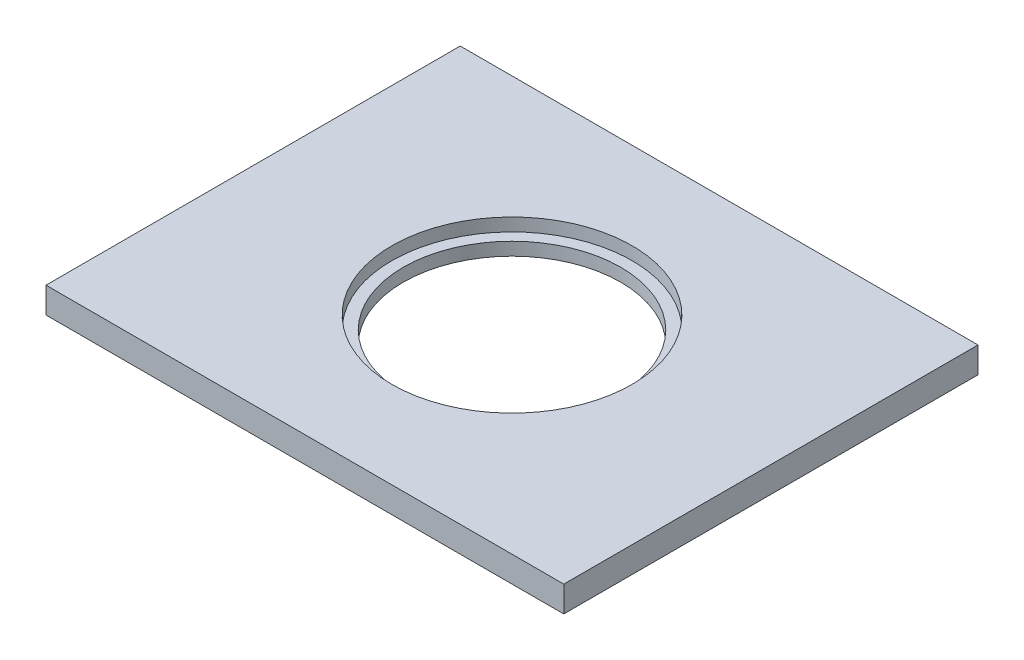
ISO-10303-21;
HEADER;
FILE_DESCRIPTION(('STEP AP214'),'2;1');
FILE_NAME('part.step','',(''),(''),'','','');
FILE_SCHEMA(('AUTOMOTIVE_DESIGN { 1 0 10303 214 1 1 1 1 }'));
ENDSEC;
DATA;
#1=APPLICATION_CONTEXT('core data for automotive mechanical design processes');
#2=APPLICATION_PROTOCOL_DEFINITION('international standard','automotive_design',2000,#1);
#3=PRODUCT_CONTEXT('',#1,'mechanical');
#4=PRODUCT('Part','Part','',(#3));
#5=PRODUCT_RELATED_PRODUCT_CATEGORY('part','',(#4));
#6=PRODUCT_DEFINITION_FORMATION('','',#4);
#7=PRODUCT_DEFINITION_CONTEXT('part definition',#1,'design');
#8=PRODUCT_DEFINITION('design','',#6,#7);
#9=PRODUCT_DEFINITION_SHAPE('','',#8);
#10=(LENGTH_UNIT() NAMED_UNIT(*) SI_UNIT(.MILLI.,.METRE.));
#11=(NAMED_UNIT(*) PLANE_ANGLE_UNIT() SI_UNIT($,.RADIAN.));
#12=(NAMED_UNIT(*) SI_UNIT($,.STERADIAN.) SOLID_ANGLE_UNIT());
#13=UNCERTAINTY_MEASURE_WITH_UNIT(LENGTH_MEASURE(1.E-05),#10,'distance_accuracy_value','');
#14=(GEOMETRIC_REPRESENTATION_CONTEXT(3) GLOBAL_UNCERTAINTY_ASSIGNED_CONTEXT((#13)) GLOBAL_UNIT_ASSIGNED_CONTEXT((#10,
#11,#12)) REPRESENTATION_CONTEXT('',''));
#15=CARTESIAN_POINT('',(0.,0.,0.));
#16=DIRECTION('',(0.,0.,1.));
#17=DIRECTION('',(1.,0.,0.));
#18=AXIS2_PLACEMENT_3D('',#15,#16,#17);
#19=CARTESIAN_POINT('',(0.,-3.,0.));
#20=DIRECTION('',(0.,1.,0.));
#21=DIRECTION('',(0.,0.,1.));
#22=AXIS2_PLACEMENT_3D('',#19,#20,#21);
#23=CYLINDRICAL_SURFACE('',#22,21.);
#24=CARTESIAN_POINT('',(0.,0.,0.));
#25=DIRECTION('',(0.,-1.,0.));
#26=DIRECTION('',(0.,0.,-1.));
#27=AXIS2_PLACEMENT_3D('',#24,#25,#26);
#28=CIRCLE('',#27,21.);
#29=CARTESIAN_POINT('',(0.,0.,-21.));
#30=VERTEX_POINT('',#29);
#31=EDGE_CURVE('E115',#30,#30,#28,.T.);
#32=ORIENTED_EDGE('',*,*,#31,.T.);
#33=EDGE_LOOP('',(#32));
#34=FACE_BOUND('',#33,.T.);
#35=CARTESIAN_POINT('',(0.,2.5,0.));
#36=DIRECTION('',(0.,1.,0.));
#37=DIRECTION('',(0.,0.,1.));
#38=AXIS2_PLACEMENT_3D('',#35,#36,#37);
#39=CIRCLE('',#38,21.);
#40=CARTESIAN_POINT('',(0.,2.5,21.));
#41=VERTEX_POINT('',#40);
#42=EDGE_CURVE('E43',#41,#41,#39,.F.);
#43=ORIENTED_EDGE('',*,*,#42,.F.);
#44=EDGE_LOOP('',(#43));
#45=FACE_BOUND('',#44,.T.);
#46=ADVANCED_FACE('F39',(#34,#45),#23,.F.);
#47=CARTESIAN_POINT('',(50.,5.,40.));
#48=DIRECTION('',(-1.,0.,0.));
#49=DIRECTION('',(0.,0.,1.));
#50=AXIS2_PLACEMENT_3D('',#47,#48,#49);
#51=PLANE('',#50);
#52=DIRECTION('',(0.,0.,-1.));
#53=VECTOR('',#52,1.);
#54=CARTESIAN_POINT('',(50.,0.,40.));
#55=LINE('',#54,#53);
#56=CARTESIAN_POINT('',(50.,0.,40.));
#57=VERTEX_POINT('',#56);
#58=CARTESIAN_POINT('',(50.,0.,-40.));
#59=VERTEX_POINT('',#58);
#60=EDGE_CURVE('E111',#57,#59,#55,.T.);
#61=ORIENTED_EDGE('',*,*,#60,.T.);
#62=DIRECTION('',(0.,-1.,0.));
#63=VECTOR('',#62,1.);
#64=CARTESIAN_POINT('',(50.,5.,-40.));
#65=LINE('',#64,#63);
#66=CARTESIAN_POINT('',(50.,5.,-40.));
#67=VERTEX_POINT('',#66);
#68=EDGE_CURVE('E11',#67,#59,#65,.T.);
#69=ORIENTED_EDGE('',*,*,#68,.F.);
#70=DIRECTION('',(0.,0.,-1.));
#71=VECTOR('',#70,1.);
#72=CARTESIAN_POINT('',(50.,5.,40.));
#73=LINE('',#72,#71);
#74=CARTESIAN_POINT('',(50.,5.,40.));
#75=VERTEX_POINT('',#74);
#76=EDGE_CURVE('E94',#75,#67,#73,.T.);
#77=ORIENTED_EDGE('',*,*,#76,.F.);
#78=DIRECTION('',(0.,-1.,0.));
#79=VECTOR('',#78,1.);
#80=CARTESIAN_POINT('',(50.,5.,40.));
#81=LINE('',#80,#79);
#82=EDGE_CURVE('E107',#75,#57,#81,.T.);
#83=ORIENTED_EDGE('',*,*,#82,.T.);
#84=EDGE_LOOP('',(#61,#69,#77,#83));
#85=FACE_BOUND('',#84,.T.);
#86=ADVANCED_FACE('F41',(#85),#51,.F.);
#87=CARTESIAN_POINT('',(-50.,5.,-40.));
#88=DIRECTION('',(0.,0.,1.));
#89=DIRECTION('',(1.,0.,0.));
#90=AXIS2_PLACEMENT_3D('',#87,#88,#89);
#91=PLANE('',#90);
#92=DIRECTION('',(-1.,0.,0.));
#93=VECTOR('',#92,1.);
#94=CARTESIAN_POINT('',(-50.,0.,-40.));
#95=LINE('',#94,#93);
#96=CARTESIAN_POINT('',(-50.,0.,-40.));
#97=VERTEX_POINT('',#96);
#98=EDGE_CURVE('E99',#59,#97,#95,.T.);
#99=ORIENTED_EDGE('',*,*,#98,.T.);
#100=DIRECTION('',(0.,-1.,0.));
#101=VECTOR('',#100,1.);
#102=CARTESIAN_POINT('',(-50.,5.,-40.));
#103=LINE('',#102,#101);
#104=CARTESIAN_POINT('',(-50.,5.,-40.));
#105=VERTEX_POINT('',#104);
#106=EDGE_CURVE('E50',#105,#97,#103,.T.);
#107=ORIENTED_EDGE('',*,*,#106,.F.);
#108=DIRECTION('',(-1.,0.,0.));
#109=VECTOR('',#108,1.);
#110=CARTESIAN_POINT('',(-50.,5.,-40.));
#111=LINE('',#110,#109);
#112=EDGE_CURVE('E89',#67,#105,#111,.T.);
#113=ORIENTED_EDGE('',*,*,#112,.F.);
#114=ORIENTED_EDGE('',*,*,#68,.T.);
#115=EDGE_LOOP('',(#99,#107,#113,#114));
#116=FACE_BOUND('',#115,.T.);
#117=ADVANCED_FACE('F98',(#116),#91,.F.);
#118=CARTESIAN_POINT('',(-50.,5.,40.));
#119=DIRECTION('',(1.,0.,0.));
#120=DIRECTION('',(0.,0.,-1.));
#121=AXIS2_PLACEMENT_3D('',#118,#119,#120);
#122=PLANE('',#121);
#123=DIRECTION('',(0.,0.,1.));
#124=VECTOR('',#123,1.);
#125=CARTESIAN_POINT('',(-50.,0.,40.));
#126=LINE('',#125,#124);
#127=CARTESIAN_POINT('',(-50.,0.,40.));
#128=VERTEX_POINT('',#127);
#129=EDGE_CURVE('E76',#97,#128,#126,.T.);
#130=ORIENTED_EDGE('',*,*,#129,.T.);
#131=DIRECTION('',(0.,-1.,0.));
#132=VECTOR('',#131,1.);
#133=CARTESIAN_POINT('',(-50.,5.,40.));
#134=LINE('',#133,#132);
#135=CARTESIAN_POINT('',(-50.,5.,40.));
#136=VERTEX_POINT('',#135);
#137=EDGE_CURVE('E101',#136,#128,#134,.T.);
#138=ORIENTED_EDGE('',*,*,#137,.F.);
#139=DIRECTION('',(0.,0.,1.));
#140=VECTOR('',#139,1.);
#141=CARTESIAN_POINT('',(-50.,5.,40.));
#142=LINE('',#141,#140);
#143=EDGE_CURVE('E92',#105,#136,#142,.T.);
#144=ORIENTED_EDGE('',*,*,#143,.F.);
#145=ORIENTED_EDGE('',*,*,#106,.T.);
#146=EDGE_LOOP('',(#130,#138,#144,#145));
#147=FACE_BOUND('',#146,.T.);
#148=ADVANCED_FACE('F103',(#147),#122,.F.);
#149=CARTESIAN_POINT('',(-50.,5.,40.));
#150=DIRECTION('',(0.,0.,-1.));
#151=DIRECTION('',(-1.,0.,0.));
#152=AXIS2_PLACEMENT_3D('',#149,#150,#151);
#153=PLANE('',#152);
#154=DIRECTION('',(1.,0.,0.));
#155=VECTOR('',#154,1.);
#156=CARTESIAN_POINT('',(-50.,0.,40.));
#157=LINE('',#156,#155);
#158=EDGE_CURVE('E82',#128,#57,#157,.T.);
#159=ORIENTED_EDGE('',*,*,#158,.T.);
#160=ORIENTED_EDGE('',*,*,#82,.F.);
#161=DIRECTION('',(1.,0.,0.));
#162=VECTOR('',#161,1.);
#163=CARTESIAN_POINT('',(-50.,5.,40.));
#164=LINE('',#163,#162);
#165=EDGE_CURVE('E59',#136,#75,#164,.T.);
#166=ORIENTED_EDGE('',*,*,#165,.F.);
#167=ORIENTED_EDGE('',*,*,#137,.T.);
#168=EDGE_LOOP('',(#159,#160,#166,#167));
#169=FACE_BOUND('',#168,.T.);
#170=ADVANCED_FACE('F150',(#169),#153,.F.);
#171=CARTESIAN_POINT('',(0.,5.,0.));
#172=DIRECTION('',(0.,-1.,0.));
#173=DIRECTION('',(0.,0.,-1.));
#174=AXIS2_PLACEMENT_3D('',#171,#172,#173);
#175=PLANE('',#174);
#176=CARTESIAN_POINT('',(0.,5.,0.));
#177=DIRECTION('',(0.,1.,0.));
#178=DIRECTION('',(0.,0.,1.));
#179=AXIS2_PLACEMENT_3D('',#176,#177,#178);
#180=CIRCLE('',#179,23.2);
#181=CARTESIAN_POINT('',(0.,5.,23.2));
#182=VERTEX_POINT('',#181);
#183=EDGE_CURVE('E136',#182,#182,#180,.T.);
#184=ORIENTED_EDGE('',*,*,#183,.F.);
#185=EDGE_LOOP('',(#184));
#186=FACE_BOUND('',#185,.T.);
#187=ORIENTED_EDGE('',*,*,#76,.T.);
#188=ORIENTED_EDGE('',*,*,#112,.T.);
#189=ORIENTED_EDGE('',*,*,#143,.T.);
#190=ORIENTED_EDGE('',*,*,#165,.T.);
#191=EDGE_LOOP('',(#187,#188,#189,#190));
#192=FACE_BOUND('',#191,.T.);
#193=ADVANCED_FACE('F90',(#186,#192),#175,.F.);
#194=CARTESIAN_POINT('',(0.,0.,0.));
#195=DIRECTION('',(0.,-1.,0.));
#196=DIRECTION('',(0.,0.,-1.));
#197=AXIS2_PLACEMENT_3D('',#194,#195,#196);
#198=PLANE('',#197);
#199=ORIENTED_EDGE('',*,*,#31,.F.);
#200=EDGE_LOOP('',(#199));
#201=FACE_BOUND('',#200,.T.);
#202=ORIENTED_EDGE('',*,*,#60,.F.);
#203=ORIENTED_EDGE('',*,*,#158,.F.);
#204=ORIENTED_EDGE('',*,*,#129,.F.);
#205=ORIENTED_EDGE('',*,*,#98,.F.);
#206=EDGE_LOOP('',(#202,#203,#204,#205));
#207=FACE_BOUND('',#206,.T.);
#208=ADVANCED_FACE('F149',(#201,#207),#198,.T.);
#209=CARTESIAN_POINT('',(0.,2.5,0.));
#210=DIRECTION('',(0.,1.,0.));
#211=DIRECTION('',(0.,0.,1.));
#212=AXIS2_PLACEMENT_3D('',#209,#210,#211);
#213=PLANE('',#212);
#214=CARTESIAN_POINT('',(0.,2.5,0.));
#215=DIRECTION('',(0.,1.,0.));
#216=DIRECTION('',(0.,0.,1.));
#217=AXIS2_PLACEMENT_3D('',#214,#215,#216);
#218=CIRCLE('',#217,23.2);
#219=CARTESIAN_POINT('',(0.,2.5,23.2));
#220=VERTEX_POINT('',#219);
#221=EDGE_CURVE('E131',#220,#220,#218,.T.);
#222=ORIENTED_EDGE('',*,*,#221,.T.);
#223=EDGE_LOOP('',(#222));
#224=FACE_BOUND('',#223,.T.);
#225=ORIENTED_EDGE('',*,*,#42,.T.);
#226=EDGE_LOOP('',(#225));
#227=FACE_BOUND('',#226,.T.);
#228=ADVANCED_FACE('F156',(#224,#227),#213,.T.);
#229=CARTESIAN_POINT('',(0.,2.5,0.));
#230=DIRECTION('',(0.,1.,0.));
#231=DIRECTION('',(0.,0.,1.));
#232=AXIS2_PLACEMENT_3D('',#229,#230,#231);
#233=CYLINDRICAL_SURFACE('',#232,23.2);
#234=ORIENTED_EDGE('',*,*,#221,.F.);
#235=EDGE_LOOP('',(#234));
#236=FACE_BOUND('',#235,.T.);
#237=ORIENTED_EDGE('',*,*,#183,.T.);
#238=EDGE_LOOP('',(#237));
#239=FACE_BOUND('',#238,.T.);
#240=ADVANCED_FACE('F146',(#236,#239),#233,.F.);
#241=CLOSED_SHELL('',(#46,#86,#117,#148,#170,#193,#208,#228,#240));
#242=MANIFOLD_SOLID_BREP('B2',#241);
#243=ADVANCED_BREP_SHAPE_REPRESENTATION('',(#18,#242),#14);
#244=SHAPE_DEFINITION_REPRESENTATION(#9,#243);
ENDSEC;
END-ISO-10303-21;
